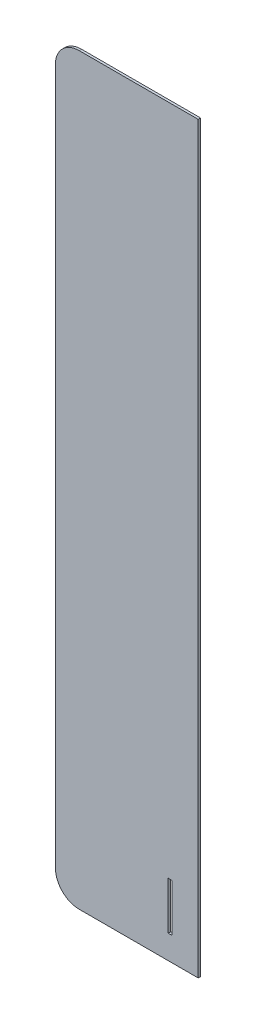
ISO-10303-21;
HEADER;
FILE_DESCRIPTION(('STEP AP214'),'2;1');
FILE_NAME('part.step','',(''),(''),'','','');
FILE_SCHEMA(('AUTOMOTIVE_DESIGN { 1 0 10303 214 1 1 1 1 }'));
ENDSEC;
DATA;
#1=APPLICATION_CONTEXT('core data for automotive mechanical design processes');
#2=APPLICATION_PROTOCOL_DEFINITION('international standard','automotive_design',2000,#1);
#3=PRODUCT_CONTEXT('',#1,'mechanical');
#4=PRODUCT('Part','Part','',(#3));
#5=PRODUCT_RELATED_PRODUCT_CATEGORY('part','',(#4));
#6=PRODUCT_DEFINITION_FORMATION('','',#4);
#7=PRODUCT_DEFINITION_CONTEXT('part definition',#1,'design');
#8=PRODUCT_DEFINITION('design','',#6,#7);
#9=PRODUCT_DEFINITION_SHAPE('','',#8);
#10=(LENGTH_UNIT() NAMED_UNIT(*) SI_UNIT(.MILLI.,.METRE.));
#11=(NAMED_UNIT(*) PLANE_ANGLE_UNIT() SI_UNIT($,.RADIAN.));
#12=(NAMED_UNIT(*) SI_UNIT($,.STERADIAN.) SOLID_ANGLE_UNIT());
#13=UNCERTAINTY_MEASURE_WITH_UNIT(LENGTH_MEASURE(1.E-05),#10,'distance_accuracy_value','');
#14=(GEOMETRIC_REPRESENTATION_CONTEXT(3) GLOBAL_UNCERTAINTY_ASSIGNED_CONTEXT((#13)) GLOBAL_UNIT_ASSIGNED_CONTEXT((#10,
#11,#12)) REPRESENTATION_CONTEXT('',''));
#15=CARTESIAN_POINT('',(0.,0.,0.));
#16=DIRECTION('',(0.,0.,1.));
#17=DIRECTION('',(1.,0.,0.));
#18=AXIS2_PLACEMENT_3D('',#15,#16,#17);
#19=CARTESIAN_POINT('',(150.,-781.,5.));
#20=DIRECTION('',(-1.,0.,0.));
#21=DIRECTION('',(0.,0.,1.));
#22=AXIS2_PLACEMENT_3D('',#19,#20,#21);
#23=PLANE('',#22);
#24=DIRECTION('',(0.,1.,0.));
#25=VECTOR('',#24,1.);
#26=CARTESIAN_POINT('',(150.,-781.,0.));
#27=LINE('',#26,#25);
#28=CARTESIAN_POINT('',(150.,-781.,0.));
#29=VERTEX_POINT('',#28);
#30=CARTESIAN_POINT('',(150.,781.,0.));
#31=VERTEX_POINT('',#30);
#32=EDGE_CURVE('E155',#29,#31,#27,.T.);
#33=ORIENTED_EDGE('',*,*,#32,.T.);
#34=DIRECTION('',(0.,0.,-1.));
#35=VECTOR('',#34,1.);
#36=CARTESIAN_POINT('',(150.,781.,5.));
#37=LINE('',#36,#35);
#38=CARTESIAN_POINT('',(150.,781.,5.));
#39=VERTEX_POINT('',#38);
#40=EDGE_CURVE('E180',#39,#31,#37,.T.);
#41=ORIENTED_EDGE('',*,*,#40,.F.);
#42=DIRECTION('',(0.,1.,0.));
#43=VECTOR('',#42,1.);
#44=CARTESIAN_POINT('',(150.,-781.,5.));
#45=LINE('',#44,#43);
#46=CARTESIAN_POINT('',(150.,-781.,5.));
#47=VERTEX_POINT('',#46);
#48=EDGE_CURVE('E156',#47,#39,#45,.T.);
#49=ORIENTED_EDGE('',*,*,#48,.F.);
#50=DIRECTION('',(0.,0.,-1.));
#51=VECTOR('',#50,1.);
#52=CARTESIAN_POINT('',(150.,-781.,5.));
#53=LINE('',#52,#51);
#54=EDGE_CURVE('E168',#47,#29,#53,.T.);
#55=ORIENTED_EDGE('',*,*,#54,.T.);
#56=EDGE_LOOP('',(#33,#41,#49,#55));
#57=FACE_BOUND('',#56,.T.);
#58=ADVANCED_FACE('F41',(#57),#23,.F.);
#59=CARTESIAN_POINT('',(-150.,781.,5.));
#60=DIRECTION('',(0.,-1.,0.));
#61=DIRECTION('',(0.,0.,-1.));
#62=AXIS2_PLACEMENT_3D('',#59,#60,#61);
#63=PLANE('',#62);
#64=DIRECTION('',(-1.,0.,0.));
#65=VECTOR('',#64,1.);
#66=CARTESIAN_POINT('',(-150.,781.,0.));
#67=LINE('',#66,#65);
#68=CARTESIAN_POINT('',(-100.,781.,0.));
#69=VERTEX_POINT('',#68);
#70=EDGE_CURVE('E171',#31,#69,#67,.T.);
#71=ORIENTED_EDGE('',*,*,#70,.T.);
#72=DIRECTION('',(0.,0.,-1.));
#73=VECTOR('',#72,1.);
#74=CARTESIAN_POINT('',(-100.,781.,5.));
#75=LINE('',#74,#73);
#76=CARTESIAN_POINT('',(-100.,781.,5.));
#77=VERTEX_POINT('',#76);
#78=EDGE_CURVE('E11',#69,#77,#75,.F.);
#79=ORIENTED_EDGE('',*,*,#78,.T.);
#80=DIRECTION('',(-1.,0.,0.));
#81=VECTOR('',#80,1.);
#82=CARTESIAN_POINT('',(-150.,781.,5.));
#83=LINE('',#82,#81);
#84=EDGE_CURVE('E159',#39,#77,#83,.T.);
#85=ORIENTED_EDGE('',*,*,#84,.F.);
#86=ORIENTED_EDGE('',*,*,#40,.T.);
#87=EDGE_LOOP('',(#71,#79,#85,#86));
#88=FACE_BOUND('',#87,.T.);
#89=ADVANCED_FACE('F219',(#88),#63,.F.);
#90=CARTESIAN_POINT('',(-150.,-781.,5.));
#91=DIRECTION('',(1.,0.,0.));
#92=DIRECTION('',(0.,0.,-1.));
#93=AXIS2_PLACEMENT_3D('',#90,#91,#92);
#94=PLANE('',#93);
#95=DIRECTION('',(0.,-1.,0.));
#96=VECTOR('',#95,1.);
#97=CARTESIAN_POINT('',(-150.,-781.,0.));
#98=LINE('',#97,#96);
#99=CARTESIAN_POINT('',(-150.,731.,0.));
#100=VERTEX_POINT('',#99);
#101=CARTESIAN_POINT('',(-150.,-731.,0.));
#102=VERTEX_POINT('',#101);
#103=EDGE_CURVE('E174',#100,#102,#98,.T.);
#104=ORIENTED_EDGE('',*,*,#103,.T.);
#105=DIRECTION('',(0.,0.,-1.));
#106=VECTOR('',#105,1.);
#107=CARTESIAN_POINT('',(-150.,-731.,5.));
#108=LINE('',#107,#106);
#109=CARTESIAN_POINT('',(-150.,-731.,5.));
#110=VERTEX_POINT('',#109);
#111=EDGE_CURVE('E193',#102,#110,#108,.F.);
#112=ORIENTED_EDGE('',*,*,#111,.T.);
#113=DIRECTION('',(0.,-1.,0.));
#114=VECTOR('',#113,1.);
#115=CARTESIAN_POINT('',(-150.,-781.,5.));
#116=LINE('',#115,#114);
#117=CARTESIAN_POINT('',(-150.,731.,5.));
#118=VERTEX_POINT('',#117);
#119=EDGE_CURVE('E163',#118,#110,#116,.T.);
#120=ORIENTED_EDGE('',*,*,#119,.F.);
#121=DIRECTION('',(0.,0.,-1.));
#122=VECTOR('',#121,1.);
#123=CARTESIAN_POINT('',(-150.,731.,5.));
#124=LINE('',#123,#122);
#125=EDGE_CURVE('E190',#118,#100,#124,.T.);
#126=ORIENTED_EDGE('',*,*,#125,.T.);
#127=EDGE_LOOP('',(#104,#112,#120,#126));
#128=FACE_BOUND('',#127,.T.);
#129=ADVANCED_FACE('F213',(#128),#94,.F.);
#130=CARTESIAN_POINT('',(-150.,-781.,5.));
#131=DIRECTION('',(0.,1.,0.));
#132=DIRECTION('',(0.,0.,1.));
#133=AXIS2_PLACEMENT_3D('',#130,#131,#132);
#134=PLANE('',#133);
#135=DIRECTION('',(1.,0.,0.));
#136=VECTOR('',#135,1.);
#137=CARTESIAN_POINT('',(-150.,-781.,5.));
#138=LINE('',#137,#136);
#139=CARTESIAN_POINT('',(-100.,-781.,5.));
#140=VERTEX_POINT('',#139);
#141=EDGE_CURVE('E166',#140,#47,#138,.T.);
#142=ORIENTED_EDGE('',*,*,#141,.F.);
#143=DIRECTION('',(0.,0.,-1.));
#144=VECTOR('',#143,1.);
#145=CARTESIAN_POINT('',(-100.,-781.,5.));
#146=LINE('',#145,#144);
#147=CARTESIAN_POINT('',(-100.,-781.,0.));
#148=VERTEX_POINT('',#147);
#149=EDGE_CURVE('E183',#140,#148,#146,.T.);
#150=ORIENTED_EDGE('',*,*,#149,.T.);
#151=DIRECTION('',(1.,0.,0.));
#152=VECTOR('',#151,1.);
#153=CARTESIAN_POINT('',(-150.,-781.,0.));
#154=LINE('',#153,#152);
#155=EDGE_CURVE('E160',#148,#29,#154,.T.);
#156=ORIENTED_EDGE('',*,*,#155,.T.);
#157=ORIENTED_EDGE('',*,*,#54,.F.);
#158=EDGE_LOOP('',(#142,#150,#156,#157));
#159=FACE_BOUND('',#158,.T.);
#160=ADVANCED_FACE('F206',(#159),#134,.F.);
#161=CARTESIAN_POINT('',(0.,0.,5.));
#162=DIRECTION('',(0.,0.,-1.));
#163=DIRECTION('',(-1.,0.,0.));
#164=AXIS2_PLACEMENT_3D('',#161,#162,#163);
#165=PLANE('',#164);
#166=DIRECTION('',(-1.,0.,0.));
#167=VECTOR('',#166,1.);
#168=CARTESIAN_POINT('',(0.,-731.,5.));
#169=LINE('',#168,#167);
#170=CARTESIAN_POINT('',(95.,-731.,5.));
#171=VERTEX_POINT('',#170);
#172=CARTESIAN_POINT('',(87.,-731.,5.));
#173=VERTEX_POINT('',#172);
#174=EDGE_CURVE('E142',#171,#173,#169,.T.);
#175=ORIENTED_EDGE('',*,*,#174,.T.);
#176=DIRECTION('',(0.,1.,0.));
#177=VECTOR('',#176,1.);
#178=CARTESIAN_POINT('',(87.,0.,5.));
#179=LINE('',#178,#177);
#180=CARTESIAN_POINT('',(87.,-631.,5.));
#181=VERTEX_POINT('',#180);
#182=EDGE_CURVE('E123',#173,#181,#179,.T.);
#183=ORIENTED_EDGE('',*,*,#182,.T.);
#184=DIRECTION('',(1.,0.,0.));
#185=VECTOR('',#184,1.);
#186=CARTESIAN_POINT('',(0.,-631.,5.));
#187=LINE('',#186,#185);
#188=CARTESIAN_POINT('',(95.,-631.,5.));
#189=VERTEX_POINT('',#188);
#190=EDGE_CURVE('E151',#181,#189,#187,.T.);
#191=ORIENTED_EDGE('',*,*,#190,.T.);
#192=DIRECTION('',(0.,-1.,0.));
#193=VECTOR('',#192,1.);
#194=CARTESIAN_POINT('',(94.9999999999999,0.,5.));
#195=LINE('',#194,#193);
#196=EDGE_CURVE('E148',#189,#171,#195,.T.);
#197=ORIENTED_EDGE('',*,*,#196,.T.);
#198=EDGE_LOOP('',(#175,#183,#191,#197));
#199=FACE_BOUND('',#198,.T.);
#200=ORIENTED_EDGE('',*,*,#119,.T.);
#201=CARTESIAN_POINT('',(-100.,-731.,5.));
#202=DIRECTION('',(0.,0.,-1.));
#203=DIRECTION('',(-1.,0.,0.));
#204=AXIS2_PLACEMENT_3D('',#201,#202,#203);
#205=CIRCLE('',#204,50.);
#206=EDGE_CURVE('E49',#110,#140,#205,.F.);
#207=ORIENTED_EDGE('',*,*,#206,.T.);
#208=ORIENTED_EDGE('',*,*,#141,.T.);
#209=ORIENTED_EDGE('',*,*,#48,.T.);
#210=ORIENTED_EDGE('',*,*,#84,.T.);
#211=CARTESIAN_POINT('',(-100.,731.,5.));
#212=DIRECTION('',(0.,0.,-1.));
#213=DIRECTION('',(-1.,0.,0.));
#214=AXIS2_PLACEMENT_3D('',#211,#212,#213);
#215=CIRCLE('',#214,50.);
#216=EDGE_CURVE('E195',#77,#118,#215,.F.);
#217=ORIENTED_EDGE('',*,*,#216,.T.);
#218=EDGE_LOOP('',(#200,#207,#208,#209,#210,#217));
#219=FACE_BOUND('',#218,.T.);
#220=ADVANCED_FACE('F199',(#199,#219),#165,.F.);
#221=CARTESIAN_POINT('',(0.,0.,0.));
#222=DIRECTION('',(0.,0.,-1.));
#223=DIRECTION('',(-1.,0.,0.));
#224=AXIS2_PLACEMENT_3D('',#221,#222,#223);
#225=PLANE('',#224);
#226=DIRECTION('',(0.,-1.,0.));
#227=VECTOR('',#226,1.);
#228=CARTESIAN_POINT('',(87.,-631.,0.));
#229=LINE('',#228,#227);
#230=CARTESIAN_POINT('',(87.,-631.,0.));
#231=VERTEX_POINT('',#230);
#232=CARTESIAN_POINT('',(87.,-731.,0.));
#233=VERTEX_POINT('',#232);
#234=EDGE_CURVE('E120',#231,#233,#229,.T.);
#235=ORIENTED_EDGE('',*,*,#234,.T.);
#236=DIRECTION('',(1.,0.,0.));
#237=VECTOR('',#236,1.);
#238=CARTESIAN_POINT('',(87.,-731.,0.));
#239=LINE('',#238,#237);
#240=CARTESIAN_POINT('',(95.,-731.,0.));
#241=VERTEX_POINT('',#240);
#242=EDGE_CURVE('E129',#233,#241,#239,.T.);
#243=ORIENTED_EDGE('',*,*,#242,.T.);
#244=DIRECTION('',(0.,1.,0.));
#245=VECTOR('',#244,1.);
#246=CARTESIAN_POINT('',(95.,-631.,0.));
#247=LINE('',#246,#245);
#248=CARTESIAN_POINT('',(95.,-631.,0.));
#249=VERTEX_POINT('',#248);
#250=EDGE_CURVE('E64',#241,#249,#247,.T.);
#251=ORIENTED_EDGE('',*,*,#250,.T.);
#252=DIRECTION('',(-1.,0.,0.));
#253=VECTOR('',#252,1.);
#254=CARTESIAN_POINT('',(87.,-631.,0.));
#255=LINE('',#254,#253);
#256=EDGE_CURVE('E126',#249,#231,#255,.T.);
#257=ORIENTED_EDGE('',*,*,#256,.T.);
#258=EDGE_LOOP('',(#235,#243,#251,#257));
#259=FACE_BOUND('',#258,.T.);
#260=ORIENTED_EDGE('',*,*,#155,.F.);
#261=CARTESIAN_POINT('',(-100.,-731.,0.));
#262=DIRECTION('',(0.,0.,-1.));
#263=DIRECTION('',(-1.,0.,0.));
#264=AXIS2_PLACEMENT_3D('',#261,#262,#263);
#265=CIRCLE('',#264,50.);
#266=EDGE_CURVE('E188',#148,#102,#265,.T.);
#267=ORIENTED_EDGE('',*,*,#266,.T.);
#268=ORIENTED_EDGE('',*,*,#103,.F.);
#269=CARTESIAN_POINT('',(-100.,731.,0.));
#270=DIRECTION('',(0.,0.,-1.));
#271=DIRECTION('',(-1.,0.,0.));
#272=AXIS2_PLACEMENT_3D('',#269,#270,#271);
#273=CIRCLE('',#272,50.);
#274=EDGE_CURVE('E186',#100,#69,#273,.T.);
#275=ORIENTED_EDGE('',*,*,#274,.T.);
#276=ORIENTED_EDGE('',*,*,#70,.F.);
#277=ORIENTED_EDGE('',*,*,#32,.F.);
#278=EDGE_LOOP('',(#260,#267,#268,#275,#276,#277));
#279=FACE_BOUND('',#278,.T.);
#280=ADVANCED_FACE('F133',(#259,#279),#225,.T.);
#281=CARTESIAN_POINT('',(-100.,-731.,5.));
#282=DIRECTION('',(0.,0.,-1.));
#283=DIRECTION('',(-1.,0.,0.));
#284=AXIS2_PLACEMENT_3D('',#281,#282,#283);
#285=CYLINDRICAL_SURFACE('',#284,50.);
#286=ORIENTED_EDGE('',*,*,#206,.F.);
#287=ORIENTED_EDGE('',*,*,#111,.F.);
#288=ORIENTED_EDGE('',*,*,#266,.F.);
#289=ORIENTED_EDGE('',*,*,#149,.F.);
#290=EDGE_LOOP('',(#286,#287,#288,#289));
#291=FACE_BOUND('',#290,.T.);
#292=ADVANCED_FACE('F209',(#291),#285,.T.);
#293=CARTESIAN_POINT('',(-100.,731.,5.));
#294=DIRECTION('',(0.,0.,-1.));
#295=DIRECTION('',(-1.,0.,0.));
#296=AXIS2_PLACEMENT_3D('',#293,#294,#295);
#297=CYLINDRICAL_SURFACE('',#296,50.);
#298=ORIENTED_EDGE('',*,*,#216,.F.);
#299=ORIENTED_EDGE('',*,*,#78,.F.);
#300=ORIENTED_EDGE('',*,*,#274,.F.);
#301=ORIENTED_EDGE('',*,*,#125,.F.);
#302=EDGE_LOOP('',(#298,#299,#300,#301));
#303=FACE_BOUND('',#302,.T.);
#304=ADVANCED_FACE('F43',(#303),#297,.T.);
#305=CARTESIAN_POINT('',(87.,-631.,0.));
#306=DIRECTION('',(-1.,0.,0.));
#307=DIRECTION('',(0.,0.,1.));
#308=AXIS2_PLACEMENT_3D('',#305,#306,#307);
#309=PLANE('',#308);
#310=DIRECTION('',(0.,0.,1.));
#311=VECTOR('',#310,1.);
#312=CARTESIAN_POINT('',(87.,-731.,0.));
#313=LINE('',#312,#311);
#314=EDGE_CURVE('E56',#233,#173,#313,.T.);
#315=ORIENTED_EDGE('',*,*,#314,.F.);
#316=ORIENTED_EDGE('',*,*,#234,.F.);
#317=DIRECTION('',(0.,0.,1.));
#318=VECTOR('',#317,1.);
#319=CARTESIAN_POINT('',(87.,-631.,0.));
#320=LINE('',#319,#318);
#321=EDGE_CURVE('E140',#231,#181,#320,.T.);
#322=ORIENTED_EDGE('',*,*,#321,.T.);
#323=ORIENTED_EDGE('',*,*,#182,.F.);
#324=EDGE_LOOP('',(#315,#316,#322,#323));
#325=FACE_BOUND('',#324,.T.);
#326=ADVANCED_FACE('F117',(#325),#309,.F.);
#327=CARTESIAN_POINT('',(87.,-631.,0.));
#328=DIRECTION('',(0.,1.,0.));
#329=DIRECTION('',(0.,0.,1.));
#330=AXIS2_PLACEMENT_3D('',#327,#328,#329);
#331=PLANE('',#330);
#332=ORIENTED_EDGE('',*,*,#321,.F.);
#333=ORIENTED_EDGE('',*,*,#256,.F.);
#334=DIRECTION('',(0.,0.,1.));
#335=VECTOR('',#334,1.);
#336=CARTESIAN_POINT('',(95.,-631.,0.));
#337=LINE('',#336,#335);
#338=EDGE_CURVE('E143',#249,#189,#337,.T.);
#339=ORIENTED_EDGE('',*,*,#338,.T.);
#340=ORIENTED_EDGE('',*,*,#190,.F.);
#341=EDGE_LOOP('',(#332,#333,#339,#340));
#342=FACE_BOUND('',#341,.T.);
#343=ADVANCED_FACE('F283',(#342),#331,.F.);
#344=CARTESIAN_POINT('',(95.,-631.,0.));
#345=DIRECTION('',(1.,0.,0.));
#346=DIRECTION('',(0.,1.,0.));
#347=AXIS2_PLACEMENT_3D('',#344,#345,#346);
#348=PLANE('',#347);
#349=ORIENTED_EDGE('',*,*,#338,.F.);
#350=ORIENTED_EDGE('',*,*,#250,.F.);
#351=DIRECTION('',(0.,0.,1.));
#352=VECTOR('',#351,1.);
#353=CARTESIAN_POINT('',(95.,-731.,0.));
#354=LINE('',#353,#352);
#355=EDGE_CURVE('E125',#241,#171,#354,.T.);
#356=ORIENTED_EDGE('',*,*,#355,.T.);
#357=ORIENTED_EDGE('',*,*,#196,.F.);
#358=EDGE_LOOP('',(#349,#350,#356,#357));
#359=FACE_BOUND('',#358,.T.);
#360=ADVANCED_FACE('F291',(#359),#348,.F.);
#361=CARTESIAN_POINT('',(87.,-731.,0.));
#362=DIRECTION('',(0.,-1.,0.));
#363=DIRECTION('',(0.,0.,-1.));
#364=AXIS2_PLACEMENT_3D('',#361,#362,#363);
#365=PLANE('',#364);
#366=ORIENTED_EDGE('',*,*,#355,.F.);
#367=ORIENTED_EDGE('',*,*,#242,.F.);
#368=ORIENTED_EDGE('',*,*,#314,.T.);
#369=ORIENTED_EDGE('',*,*,#174,.F.);
#370=EDGE_LOOP('',(#366,#367,#368,#369));
#371=FACE_BOUND('',#370,.T.);
#372=ADVANCED_FACE('F130',(#371),#365,.F.);
#373=CLOSED_SHELL('',(#58,#89,#129,#160,#220,#280,#292,#304,#326,#343,#360,#372));
#374=MANIFOLD_SOLID_BREP('B2',#373);
#375=ADVANCED_BREP_SHAPE_REPRESENTATION('',(#18,#374),#14);
#376=SHAPE_DEFINITION_REPRESENTATION(#9,#375);
ENDSEC;
END-ISO-10303-21;
